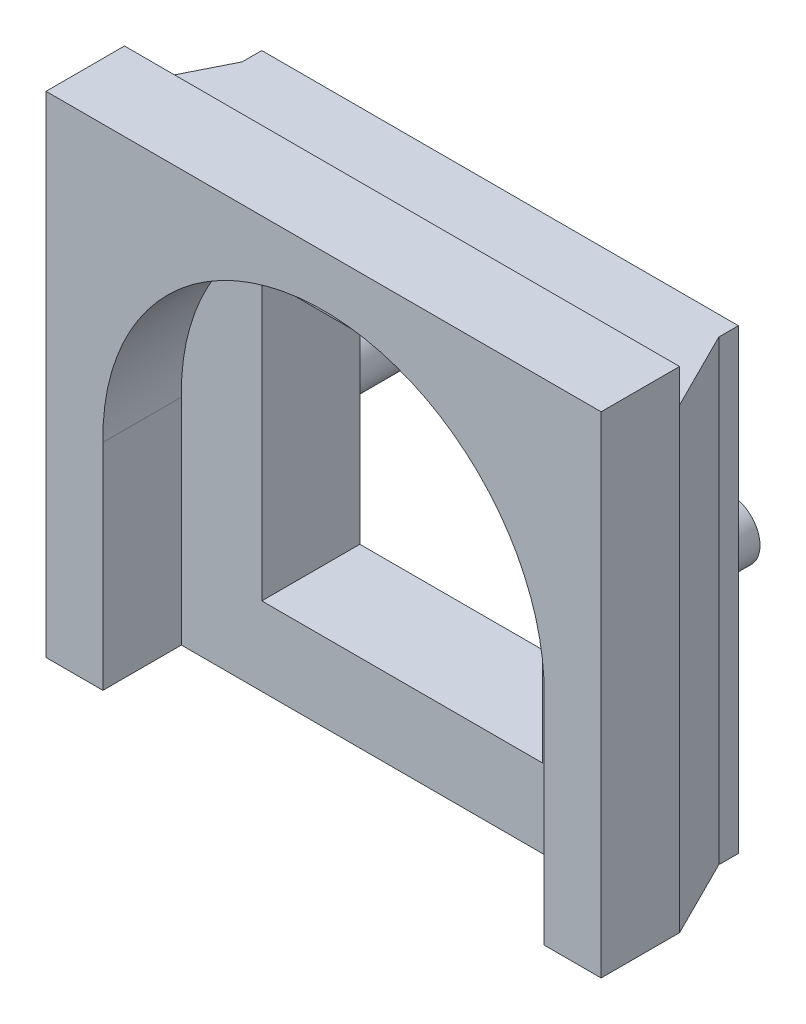
ISO-10303-21;
HEADER;
FILE_DESCRIPTION(('STEP AP214'),'2;1');
FILE_NAME('part.step','',(''),(''),'','','');
FILE_SCHEMA(('AUTOMOTIVE_DESIGN { 1 0 10303 214 1 1 1 1 }'));
ENDSEC;
DATA;
#1=APPLICATION_CONTEXT('core data for automotive mechanical design processes');
#2=APPLICATION_PROTOCOL_DEFINITION('international standard','automotive_design',2000,#1);
#3=PRODUCT_CONTEXT('',#1,'mechanical');
#4=PRODUCT('Part','Part','',(#3));
#5=PRODUCT_RELATED_PRODUCT_CATEGORY('part','',(#4));
#6=PRODUCT_DEFINITION_FORMATION('','',#4);
#7=PRODUCT_DEFINITION_CONTEXT('part definition',#1,'design');
#8=PRODUCT_DEFINITION('design','',#6,#7);
#9=PRODUCT_DEFINITION_SHAPE('','',#8);
#10=(LENGTH_UNIT() NAMED_UNIT(*) SI_UNIT(.MILLI.,.METRE.));
#11=(NAMED_UNIT(*) PLANE_ANGLE_UNIT() SI_UNIT($,.RADIAN.));
#12=(NAMED_UNIT(*) SI_UNIT($,.STERADIAN.) SOLID_ANGLE_UNIT());
#13=UNCERTAINTY_MEASURE_WITH_UNIT(LENGTH_MEASURE(1.E-05),#10,'distance_accuracy_value','');
#14=(GEOMETRIC_REPRESENTATION_CONTEXT(3) GLOBAL_UNCERTAINTY_ASSIGNED_CONTEXT((#13)) GLOBAL_UNIT_ASSIGNED_CONTEXT((#10,
#11,#12)) REPRESENTATION_CONTEXT('',''));
#15=CARTESIAN_POINT('',(0.,0.,0.));
#16=DIRECTION('',(0.,0.,1.));
#17=DIRECTION('',(1.,0.,0.));
#18=AXIS2_PLACEMENT_3D('',#15,#16,#17);
#19=CARTESIAN_POINT('',(0.,0.,4.));
#20=DIRECTION('',(0.,0.,1.));
#21=DIRECTION('',(1.,0.,0.));
#22=AXIS2_PLACEMENT_3D('',#19,#20,#21);
#23=PLANE('',#22);
#24=DIRECTION('',(0.,1.,0.));
#25=VECTOR('',#24,1.);
#26=CARTESIAN_POINT('',(14.15,-11.15,4.));
#27=LINE('',#26,#25);
#28=CARTESIAN_POINT('',(14.15,12.15,4.));
#29=VERTEX_POINT('',#28);
#30=CARTESIAN_POINT('',(14.15,13.85,4.));
#31=VERTEX_POINT('',#30);
#32=EDGE_CURVE('E221',#29,#31,#27,.T.);
#33=ORIENTED_EDGE('',*,*,#32,.F.);
#34=DIRECTION('',(-1.,0.,0.));
#35=VECTOR('',#34,1.);
#36=CARTESIAN_POINT('',(-12.15,12.15,4.));
#37=LINE('',#36,#35);
#38=CARTESIAN_POINT('',(-14.15,12.15,4.));
#39=VERTEX_POINT('',#38);
#40=EDGE_CURVE('E11',#29,#39,#37,.T.);
#41=ORIENTED_EDGE('',*,*,#40,.T.);
#42=DIRECTION('',(0.,-1.,0.));
#43=VECTOR('',#42,1.);
#44=CARTESIAN_POINT('',(-14.15,-11.15,4.));
#45=LINE('',#44,#43);
#46=CARTESIAN_POINT('',(-14.15,13.85,4.));
#47=VERTEX_POINT('',#46);
#48=EDGE_CURVE('E247',#47,#39,#45,.T.);
#49=ORIENTED_EDGE('',*,*,#48,.F.);
#50=DIRECTION('',(-1.,0.,0.));
#51=VECTOR('',#50,1.);
#52=CARTESIAN_POINT('',(-14.15,13.85,4.));
#53=LINE('',#52,#51);
#54=EDGE_CURVE('E245',#31,#47,#53,.T.);
#55=ORIENTED_EDGE('',*,*,#54,.F.);
#56=EDGE_LOOP('',(#33,#41,#49,#55));
#57=FACE_BOUND('',#56,.T.);
#58=ADVANCED_FACE('F33',(#57),#23,.F.);
#59=CARTESIAN_POINT('',(0.,0.,4.));
#60=DIRECTION('',(0.,0.,1.));
#61=DIRECTION('',(1.,0.,0.));
#62=AXIS2_PLACEMENT_3D('',#59,#60,#61);
#63=PLANE('',#62);
#64=DIRECTION('',(-1.,0.,0.));
#65=VECTOR('',#64,1.);
#66=CARTESIAN_POINT('',(-14.15,-11.15,4.));
#67=LINE('',#66,#65);
#68=CARTESIAN_POINT('',(11.2481903363964,-11.15,4.));
#69=VERTEX_POINT('',#68);
#70=CARTESIAN_POINT('',(-11.2481903363964,-11.15,4.));
#71=VERTEX_POINT('',#70);
#72=EDGE_CURVE('E205',#69,#71,#67,.T.);
#73=ORIENTED_EDGE('',*,*,#72,.F.);
#74=DIRECTION('',(0.,-1.,0.));
#75=VECTOR('',#74,1.);
#76=CARTESIAN_POINT('',(11.2481903363964,-0.201777491806097,4.));
#77=LINE('',#76,#75);
#78=CARTESIAN_POINT('',(11.2481903363964,-0.2017774918061,4.));
#79=VERTEX_POINT('',#78);
#80=EDGE_CURVE('E50',#79,#69,#77,.T.);
#81=ORIENTED_EDGE('',*,*,#80,.F.);
#82=CARTESIAN_POINT('',(0.,0.,4.));
#83=DIRECTION('',(0.,0.,-1.));
#84=DIRECTION('',(1.,0.,0.));
#85=AXIS2_PLACEMENT_3D('',#82,#83,#84);
#86=CIRCLE('',#85,11.25);
#87=CARTESIAN_POINT('',(-11.2481903363964,-0.201777491806106,4.));
#88=VERTEX_POINT('',#87);
#89=EDGE_CURVE('E54',#88,#79,#86,.T.);
#90=ORIENTED_EDGE('',*,*,#89,.F.);
#91=DIRECTION('',(0.,1.,0.));
#92=VECTOR('',#91,1.);
#93=CARTESIAN_POINT('',(-11.2481903363964,-0.201777491806106,4.));
#94=LINE('',#93,#92);
#95=EDGE_CURVE('E250',#71,#88,#94,.T.);
#96=ORIENTED_EDGE('',*,*,#95,.F.);
#97=EDGE_LOOP('',(#73,#81,#90,#96));
#98=FACE_BOUND('',#97,.T.);
#99=DIRECTION('',(-1.,0.,0.));
#100=VECTOR('',#99,1.);
#101=CARTESIAN_POINT('',(-7.15,7.15,4.));
#102=LINE('',#101,#100);
#103=CARTESIAN_POINT('',(7.15,7.15,4.));
#104=VERTEX_POINT('',#103);
#105=CARTESIAN_POINT('',(-7.15,7.15,4.));
#106=VERTEX_POINT('',#105);
#107=EDGE_CURVE('E285',#104,#106,#102,.T.);
#108=ORIENTED_EDGE('',*,*,#107,.F.);
#109=DIRECTION('',(0.,1.,0.));
#110=VECTOR('',#109,1.);
#111=CARTESIAN_POINT('',(7.15,7.15,4.));
#112=LINE('',#111,#110);
#113=CARTESIAN_POINT('',(7.15,-7.15,4.));
#114=VERTEX_POINT('',#113);
#115=EDGE_CURVE('E283',#114,#104,#112,.T.);
#116=ORIENTED_EDGE('',*,*,#115,.F.);
#117=DIRECTION('',(1.,0.,0.));
#118=VECTOR('',#117,1.);
#119=CARTESIAN_POINT('',(-7.15,-7.15,4.));
#120=LINE('',#119,#118);
#121=CARTESIAN_POINT('',(-7.15,-7.15,4.));
#122=VERTEX_POINT('',#121);
#123=EDGE_CURVE('E159',#122,#114,#120,.T.);
#124=ORIENTED_EDGE('',*,*,#123,.F.);
#125=DIRECTION('',(0.,-1.,0.));
#126=VECTOR('',#125,1.);
#127=CARTESIAN_POINT('',(-7.15,7.15,4.));
#128=LINE('',#127,#126);
#129=EDGE_CURVE('E287',#106,#122,#128,.T.);
#130=ORIENTED_EDGE('',*,*,#129,.F.);
#131=EDGE_LOOP('',(#108,#116,#124,#130));
#132=FACE_BOUND('',#131,.T.);
#133=ADVANCED_FACE('F341',(#98,#132),#63,.T.);
#134=CARTESIAN_POINT('',(-12.15,12.15,4.));
#135=DIRECTION('',(0.,-1.,0.));
#136=DIRECTION('',(0.,0.,-1.));
#137=AXIS2_PLACEMENT_3D('',#134,#135,#136);
#138=PLANE('',#137);
#139=DIRECTION('',(0.447213595499959,0.,0.894427190999915));
#140=VECTOR('',#139,1.);
#141=CARTESIAN_POINT('',(14.15,12.15,4.));
#142=LINE('',#141,#140);
#143=CARTESIAN_POINT('',(12.15,12.15,0.));
#144=VERTEX_POINT('',#143);
#145=EDGE_CURVE('E210',#144,#29,#142,.T.);
#146=ORIENTED_EDGE('',*,*,#145,.F.);
#147=DIRECTION('',(0.,0.,1.));
#148=VECTOR('',#147,1.);
#149=CARTESIAN_POINT('',(12.15,12.15,-1.));
#150=LINE('',#149,#148);
#151=CARTESIAN_POINT('',(12.15,12.15,-1.));
#152=VERTEX_POINT('',#151);
#153=EDGE_CURVE('E199',#152,#144,#150,.T.);
#154=ORIENTED_EDGE('',*,*,#153,.F.);
#155=DIRECTION('',(1.,0.,0.));
#156=VECTOR('',#155,1.);
#157=CARTESIAN_POINT('',(-12.15,12.15,-1.));
#158=LINE('',#157,#156);
#159=CARTESIAN_POINT('',(-12.15,12.15,-1.));
#160=VERTEX_POINT('',#159);
#161=EDGE_CURVE('E181',#160,#152,#158,.T.);
#162=ORIENTED_EDGE('',*,*,#161,.F.);
#163=DIRECTION('',(0.,0.,1.));
#164=VECTOR('',#163,1.);
#165=CARTESIAN_POINT('',(-12.15,12.15,-1.));
#166=LINE('',#165,#164);
#167=CARTESIAN_POINT('',(-12.15,12.15,0.));
#168=VERTEX_POINT('',#167);
#169=EDGE_CURVE('E190',#160,#168,#166,.T.);
#170=ORIENTED_EDGE('',*,*,#169,.T.);
#171=DIRECTION('',(0.447213595499957,0.,-0.894427190999917));
#172=VECTOR('',#171,1.);
#173=CARTESIAN_POINT('',(-12.15,12.15,0.));
#174=LINE('',#173,#172);
#175=EDGE_CURVE('E219',#39,#168,#174,.T.);
#176=ORIENTED_EDGE('',*,*,#175,.F.);
#177=ORIENTED_EDGE('',*,*,#40,.F.);
#178=EDGE_LOOP('',(#146,#154,#162,#170,#176,#177));
#179=FACE_BOUND('',#178,.T.);
#180=ADVANCED_FACE('F35',(#179),#138,.F.);
#181=CARTESIAN_POINT('',(7.15,7.15,4.));
#182=DIRECTION('',(-1.,0.,0.));
#183=DIRECTION('',(0.,-1.,0.));
#184=AXIS2_PLACEMENT_3D('',#181,#182,#183);
#185=PLANE('',#184);
#186=DIRECTION('',(0.,0.,-1.));
#187=VECTOR('',#186,1.);
#188=CARTESIAN_POINT('',(7.15,7.15,4.));
#189=LINE('',#188,#187);
#190=CARTESIAN_POINT('',(7.15,7.15,-1.));
#191=VERTEX_POINT('',#190);
#192=EDGE_CURVE('E168',#104,#191,#189,.T.);
#193=ORIENTED_EDGE('',*,*,#192,.T.);
#194=DIRECTION('',(0.,-1.,0.));
#195=VECTOR('',#194,1.);
#196=CARTESIAN_POINT('',(7.15,-7.15,-1.));
#197=LINE('',#196,#195);
#198=CARTESIAN_POINT('',(7.15,-7.15,-1.));
#199=VERTEX_POINT('',#198);
#200=EDGE_CURVE('E165',#191,#199,#197,.T.);
#201=ORIENTED_EDGE('',*,*,#200,.T.);
#202=DIRECTION('',(0.,0.,-1.));
#203=VECTOR('',#202,1.);
#204=CARTESIAN_POINT('',(7.15,-7.15,4.));
#205=LINE('',#204,#203);
#206=EDGE_CURVE('E152',#114,#199,#205,.T.);
#207=ORIENTED_EDGE('',*,*,#206,.F.);
#208=ORIENTED_EDGE('',*,*,#115,.T.);
#209=EDGE_LOOP('',(#193,#201,#207,#208));
#210=FACE_BOUND('',#209,.T.);
#211=ADVANCED_FACE('F166',(#210),#185,.T.);
#212=CARTESIAN_POINT('',(-7.15,7.15,4.));
#213=DIRECTION('',(0.,-1.,0.));
#214=DIRECTION('',(0.,0.,-1.));
#215=AXIS2_PLACEMENT_3D('',#212,#213,#214);
#216=PLANE('',#215);
#217=DIRECTION('',(0.,0.,-1.));
#218=VECTOR('',#217,1.);
#219=CARTESIAN_POINT('',(-7.15,7.15,4.));
#220=LINE('',#219,#218);
#221=CARTESIAN_POINT('',(-7.15,7.15,-1.));
#222=VERTEX_POINT('',#221);
#223=EDGE_CURVE('E292',#106,#222,#220,.T.);
#224=ORIENTED_EDGE('',*,*,#223,.T.);
#225=DIRECTION('',(1.,0.,0.));
#226=VECTOR('',#225,1.);
#227=CARTESIAN_POINT('',(7.15,7.15,-1.));
#228=LINE('',#227,#226);
#229=EDGE_CURVE('E177',#222,#191,#228,.T.);
#230=ORIENTED_EDGE('',*,*,#229,.T.);
#231=ORIENTED_EDGE('',*,*,#192,.F.);
#232=ORIENTED_EDGE('',*,*,#107,.T.);
#233=EDGE_LOOP('',(#224,#230,#231,#232));
#234=FACE_BOUND('',#233,.T.);
#235=ADVANCED_FACE('F356',(#234),#216,.T.);
#236=CARTESIAN_POINT('',(-7.15,7.15,4.));
#237=DIRECTION('',(1.,0.,0.));
#238=DIRECTION('',(0.,1.,0.));
#239=AXIS2_PLACEMENT_3D('',#236,#237,#238);
#240=PLANE('',#239);
#241=DIRECTION('',(0.,0.,-1.));
#242=VECTOR('',#241,1.);
#243=CARTESIAN_POINT('',(-7.15,-7.15,4.));
#244=LINE('',#243,#242);
#245=CARTESIAN_POINT('',(-7.15,-7.15,-1.));
#246=VERTEX_POINT('',#245);
#247=EDGE_CURVE('E162',#122,#246,#244,.T.);
#248=ORIENTED_EDGE('',*,*,#247,.T.);
#249=DIRECTION('',(0.,1.,0.));
#250=VECTOR('',#249,1.);
#251=CARTESIAN_POINT('',(-7.15,7.15,-1.));
#252=LINE('',#251,#250);
#253=EDGE_CURVE('E175',#246,#222,#252,.T.);
#254=ORIENTED_EDGE('',*,*,#253,.T.);
#255=ORIENTED_EDGE('',*,*,#223,.F.);
#256=ORIENTED_EDGE('',*,*,#129,.T.);
#257=EDGE_LOOP('',(#248,#254,#255,#256));
#258=FACE_BOUND('',#257,.T.);
#259=ADVANCED_FACE('F399',(#258),#240,.T.);
#260=CARTESIAN_POINT('',(-7.15,-7.15,4.));
#261=DIRECTION('',(0.,1.,0.));
#262=DIRECTION('',(0.,0.,1.));
#263=AXIS2_PLACEMENT_3D('',#260,#261,#262);
#264=PLANE('',#263);
#265=ORIENTED_EDGE('',*,*,#206,.T.);
#266=DIRECTION('',(-1.,0.,0.));
#267=VECTOR('',#266,1.);
#268=CARTESIAN_POINT('',(-7.15,-7.15,-1.));
#269=LINE('',#268,#267);
#270=EDGE_CURVE('E156',#199,#246,#269,.T.);
#271=ORIENTED_EDGE('',*,*,#270,.T.);
#272=ORIENTED_EDGE('',*,*,#247,.F.);
#273=ORIENTED_EDGE('',*,*,#123,.T.);
#274=EDGE_LOOP('',(#265,#271,#272,#273));
#275=FACE_BOUND('',#274,.T.);
#276=ADVANCED_FACE('F154',(#275),#264,.T.);
#277=CARTESIAN_POINT('',(14.15,-11.15,8.));
#278=DIRECTION('',(-1.,0.,0.));
#279=DIRECTION('',(0.,0.,1.));
#280=AXIS2_PLACEMENT_3D('',#277,#278,#279);
#281=PLANE('',#280);
#282=CARTESIAN_POINT('',(14.15,-11.15,4.));
#283=VERTEX_POINT('',#282);
#284=EDGE_CURVE('E242',#283,#29,#27,.T.);
#285=ORIENTED_EDGE('',*,*,#284,.T.);
#286=ORIENTED_EDGE('',*,*,#32,.T.);
#287=DIRECTION('',(0.,0.,-1.));
#288=VECTOR('',#287,1.);
#289=CARTESIAN_POINT('',(14.15,13.85,8.));
#290=LINE('',#289,#288);
#291=CARTESIAN_POINT('',(14.15,13.85,8.));
#292=VERTEX_POINT('',#291);
#293=EDGE_CURVE('E274',#292,#31,#290,.T.);
#294=ORIENTED_EDGE('',*,*,#293,.F.);
#295=DIRECTION('',(0.,1.,0.));
#296=VECTOR('',#295,1.);
#297=CARTESIAN_POINT('',(14.15,-11.15,8.));
#298=LINE('',#297,#296);
#299=CARTESIAN_POINT('',(14.15,-11.15,8.));
#300=VERTEX_POINT('',#299);
#301=EDGE_CURVE('E224',#300,#292,#298,.T.);
#302=ORIENTED_EDGE('',*,*,#301,.F.);
#303=DIRECTION('',(0.,0.,-1.));
#304=VECTOR('',#303,1.);
#305=CARTESIAN_POINT('',(14.15,-11.15,8.));
#306=LINE('',#305,#304);
#307=EDGE_CURVE('E241',#300,#283,#306,.T.);
#308=ORIENTED_EDGE('',*,*,#307,.T.);
#309=EDGE_LOOP('',(#285,#286,#294,#302,#308));
#310=FACE_BOUND('',#309,.T.);
#311=ADVANCED_FACE('F323',(#310),#281,.F.);
#312=CARTESIAN_POINT('',(-14.15,13.85,8.));
#313=DIRECTION('',(0.,-1.,0.));
#314=DIRECTION('',(0.,0.,-1.));
#315=AXIS2_PLACEMENT_3D('',#312,#313,#314);
#316=PLANE('',#315);
#317=ORIENTED_EDGE('',*,*,#54,.T.);
#318=DIRECTION('',(0.,0.,-1.));
#319=VECTOR('',#318,1.);
#320=CARTESIAN_POINT('',(-14.15,13.85,8.));
#321=LINE('',#320,#319);
#322=CARTESIAN_POINT('',(-14.15,13.85,8.));
#323=VERTEX_POINT('',#322);
#324=EDGE_CURVE('E271',#323,#47,#321,.T.);
#325=ORIENTED_EDGE('',*,*,#324,.F.);
#326=DIRECTION('',(-1.,0.,0.));
#327=VECTOR('',#326,1.);
#328=CARTESIAN_POINT('',(-14.15,13.85,8.));
#329=LINE('',#328,#327);
#330=EDGE_CURVE('E227',#292,#323,#329,.T.);
#331=ORIENTED_EDGE('',*,*,#330,.F.);
#332=ORIENTED_EDGE('',*,*,#293,.T.);
#333=EDGE_LOOP('',(#317,#325,#331,#332));
#334=FACE_BOUND('',#333,.T.);
#335=ADVANCED_FACE('F375',(#334),#316,.F.);
#336=CARTESIAN_POINT('',(-14.15,-11.15,8.));
#337=DIRECTION('',(1.,0.,0.));
#338=DIRECTION('',(0.,0.,-1.));
#339=AXIS2_PLACEMENT_3D('',#336,#337,#338);
#340=PLANE('',#339);
#341=ORIENTED_EDGE('',*,*,#48,.T.);
#342=DIRECTION('',(0.,-1.,0.));
#343=VECTOR('',#342,1.);
#344=CARTESIAN_POINT('',(-14.15,16.6221359549996,4.));
#345=LINE('',#344,#343);
#346=CARTESIAN_POINT('',(-14.15,-11.15,4.));
#347=VERTEX_POINT('',#346);
#348=EDGE_CURVE('E218',#39,#347,#345,.T.);
#349=ORIENTED_EDGE('',*,*,#348,.T.);
#350=DIRECTION('',(0.,0.,-1.));
#351=VECTOR('',#350,1.);
#352=CARTESIAN_POINT('',(-14.15,-11.15,8.));
#353=LINE('',#352,#351);
#354=CARTESIAN_POINT('',(-14.15,-11.15,8.));
#355=VERTEX_POINT('',#354);
#356=EDGE_CURVE('E268',#355,#347,#353,.T.);
#357=ORIENTED_EDGE('',*,*,#356,.F.);
#358=DIRECTION('',(0.,-1.,0.));
#359=VECTOR('',#358,1.);
#360=CARTESIAN_POINT('',(-14.15,-11.15,8.));
#361=LINE('',#360,#359);
#362=EDGE_CURVE('E229',#323,#355,#361,.T.);
#363=ORIENTED_EDGE('',*,*,#362,.F.);
#364=ORIENTED_EDGE('',*,*,#324,.T.);
#365=EDGE_LOOP('',(#341,#349,#357,#363,#364));
#366=FACE_BOUND('',#365,.T.);
#367=ADVANCED_FACE('F346',(#366),#340,.F.);
#368=CARTESIAN_POINT('',(-11.2481903363964,-11.15,8.));
#369=DIRECTION('',(0.,1.,0.));
#370=DIRECTION('',(-1.,0.,0.));
#371=AXIS2_PLACEMENT_3D('',#368,#369,#370);
#372=PLANE('',#371);
#373=DIRECTION('',(0.447213595499957,0.,-0.894427190999917));
#374=VECTOR('',#373,1.);
#375=CARTESIAN_POINT('',(-12.15,-11.15,0.));
#376=LINE('',#375,#374);
#377=CARTESIAN_POINT('',(-12.15,-11.15,0.));
#378=VERTEX_POINT('',#377);
#379=EDGE_CURVE('E213',#347,#378,#376,.T.);
#380=ORIENTED_EDGE('',*,*,#379,.T.);
#381=DIRECTION('',(0.,0.,1.));
#382=VECTOR('',#381,1.);
#383=CARTESIAN_POINT('',(-12.15,-11.15,-1.));
#384=LINE('',#383,#382);
#385=CARTESIAN_POINT('',(-12.15,-11.15,-1.));
#386=VERTEX_POINT('',#385);
#387=EDGE_CURVE('E193',#386,#378,#384,.T.);
#388=ORIENTED_EDGE('',*,*,#387,.F.);
#389=DIRECTION('',(-1.,0.,0.));
#390=VECTOR('',#389,1.);
#391=CARTESIAN_POINT('',(12.15,-11.15,-1.));
#392=LINE('',#391,#390);
#393=CARTESIAN_POINT('',(12.15,-11.15,-1.));
#394=VERTEX_POINT('',#393);
#395=EDGE_CURVE('E186',#394,#386,#392,.T.);
#396=ORIENTED_EDGE('',*,*,#395,.F.);
#397=DIRECTION('',(0.,0.,1.));
#398=VECTOR('',#397,1.);
#399=CARTESIAN_POINT('',(12.15,-11.15,-1.));
#400=LINE('',#399,#398);
#401=CARTESIAN_POINT('',(12.15,-11.15,0.));
#402=VERTEX_POINT('',#401);
#403=EDGE_CURVE('E196',#394,#402,#400,.T.);
#404=ORIENTED_EDGE('',*,*,#403,.T.);
#405=DIRECTION('',(0.447213595499959,0.,0.894427190999915));
#406=VECTOR('',#405,1.);
#407=CARTESIAN_POINT('',(14.15,-11.15,4.));
#408=LINE('',#407,#406);
#409=EDGE_CURVE('E207',#402,#283,#408,.T.);
#410=ORIENTED_EDGE('',*,*,#409,.T.);
#411=ORIENTED_EDGE('',*,*,#307,.F.);
#412=DIRECTION('',(1.,0.,0.));
#413=VECTOR('',#412,1.);
#414=CARTESIAN_POINT('',(11.2481903363964,-11.15,8.));
#415=LINE('',#414,#413);
#416=CARTESIAN_POINT('',(11.2481903363964,-11.15,8.));
#417=VERTEX_POINT('',#416);
#418=EDGE_CURVE('E239',#417,#300,#415,.T.);
#419=ORIENTED_EDGE('',*,*,#418,.F.);
#420=DIRECTION('',(0.,0.,-1.));
#421=VECTOR('',#420,1.);
#422=CARTESIAN_POINT('',(11.2481903363964,-11.15,8.));
#423=LINE('',#422,#421);
#424=EDGE_CURVE('E256',#417,#69,#423,.T.);
#425=ORIENTED_EDGE('',*,*,#424,.T.);
#426=ORIENTED_EDGE('',*,*,#72,.T.);
#427=DIRECTION('',(0.,0.,-1.));
#428=VECTOR('',#427,1.);
#429=CARTESIAN_POINT('',(-11.2481903363964,-11.15,8.));
#430=LINE('',#429,#428);
#431=CARTESIAN_POINT('',(-11.2481903363964,-11.15,8.));
#432=VERTEX_POINT('',#431);
#433=EDGE_CURVE('E265',#432,#71,#430,.T.);
#434=ORIENTED_EDGE('',*,*,#433,.F.);
#435=DIRECTION('',(1.,0.,0.));
#436=VECTOR('',#435,1.);
#437=CARTESIAN_POINT('',(-11.2481903363964,-11.15,8.));
#438=LINE('',#437,#436);
#439=EDGE_CURVE('E231',#355,#432,#438,.T.);
#440=ORIENTED_EDGE('',*,*,#439,.F.);
#441=ORIENTED_EDGE('',*,*,#356,.T.);
#442=EDGE_LOOP('',(#380,#388,#396,#404,#410,#411,#419,#425,#426,#434,#440,#441));
#443=FACE_BOUND('',#442,.T.);
#444=ADVANCED_FACE('F303',(#443),#372,.F.);
#445=CARTESIAN_POINT('',(-11.2481903363964,-0.201777491806106,8.));
#446=DIRECTION('',(-1.,0.,0.));
#447=DIRECTION('',(0.,0.,1.));
#448=AXIS2_PLACEMENT_3D('',#445,#446,#447);
#449=PLANE('',#448);
#450=ORIENTED_EDGE('',*,*,#95,.T.);
#451=DIRECTION('',(0.,0.,-1.));
#452=VECTOR('',#451,1.);
#453=CARTESIAN_POINT('',(-11.2481903363964,-0.201777491806106,8.));
#454=LINE('',#453,#452);
#455=CARTESIAN_POINT('',(-11.2481903363964,-0.201777491806106,8.));
#456=VERTEX_POINT('',#455);
#457=EDGE_CURVE('E262',#456,#88,#454,.T.);
#458=ORIENTED_EDGE('',*,*,#457,.F.);
#459=DIRECTION('',(0.,1.,0.));
#460=VECTOR('',#459,1.);
#461=CARTESIAN_POINT('',(-11.2481903363964,-0.201777491806106,8.));
#462=LINE('',#461,#460);
#463=EDGE_CURVE('E233',#432,#456,#462,.T.);
#464=ORIENTED_EDGE('',*,*,#463,.F.);
#465=ORIENTED_EDGE('',*,*,#433,.T.);
#466=EDGE_LOOP('',(#450,#458,#464,#465));
#467=FACE_BOUND('',#466,.T.);
#468=ADVANCED_FACE('F339',(#467),#449,.F.);
#469=CARTESIAN_POINT('',(0.,0.,8.));
#470=DIRECTION('',(0.,0.,-1.));
#471=DIRECTION('',(-1.,0.,0.));
#472=AXIS2_PLACEMENT_3D('',#469,#470,#471);
#473=CYLINDRICAL_SURFACE('',#472,11.25);
#474=ORIENTED_EDGE('',*,*,#89,.T.);
#475=DIRECTION('',(0.,0.,-1.));
#476=VECTOR('',#475,1.);
#477=CARTESIAN_POINT('',(11.2481903363964,-0.2017774918061,8.));
#478=LINE('',#477,#476);
#479=CARTESIAN_POINT('',(11.2481903363964,-0.2017774918061,8.));
#480=VERTEX_POINT('',#479);
#481=EDGE_CURVE('E259',#480,#79,#478,.T.);
#482=ORIENTED_EDGE('',*,*,#481,.F.);
#483=CARTESIAN_POINT('',(0.,0.,8.));
#484=DIRECTION('',(0.,0.,-1.));
#485=DIRECTION('',(1.,0.,0.));
#486=AXIS2_PLACEMENT_3D('',#483,#484,#485);
#487=CIRCLE('',#486,11.25);
#488=EDGE_CURVE('E235',#456,#480,#487,.T.);
#489=ORIENTED_EDGE('',*,*,#488,.F.);
#490=ORIENTED_EDGE('',*,*,#457,.T.);
#491=EDGE_LOOP('',(#474,#482,#489,#490));
#492=FACE_BOUND('',#491,.T.);
#493=ADVANCED_FACE('F335',(#492),#473,.F.);
#494=CARTESIAN_POINT('',(11.2481903363964,-0.201777491806097,8.));
#495=DIRECTION('',(1.,0.,0.));
#496=DIRECTION('',(0.,0.,-1.));
#497=AXIS2_PLACEMENT_3D('',#494,#495,#496);
#498=PLANE('',#497);
#499=ORIENTED_EDGE('',*,*,#80,.T.);
#500=ORIENTED_EDGE('',*,*,#424,.F.);
#501=DIRECTION('',(0.,-1.,0.));
#502=VECTOR('',#501,1.);
#503=CARTESIAN_POINT('',(11.2481903363964,-0.201777491806097,8.));
#504=LINE('',#503,#502);
#505=EDGE_CURVE('E237',#480,#417,#504,.T.);
#506=ORIENTED_EDGE('',*,*,#505,.F.);
#507=ORIENTED_EDGE('',*,*,#481,.T.);
#508=EDGE_LOOP('',(#499,#500,#506,#507));
#509=FACE_BOUND('',#508,.T.);
#510=ADVANCED_FACE('F333',(#509),#498,.F.);
#511=CARTESIAN_POINT('',(0.,0.,8.));
#512=DIRECTION('',(0.,0.,1.));
#513=DIRECTION('',(1.,0.,0.));
#514=AXIS2_PLACEMENT_3D('',#511,#512,#513);
#515=PLANE('',#514);
#516=ORIENTED_EDGE('',*,*,#301,.T.);
#517=ORIENTED_EDGE('',*,*,#330,.T.);
#518=ORIENTED_EDGE('',*,*,#362,.T.);
#519=ORIENTED_EDGE('',*,*,#439,.T.);
#520=ORIENTED_EDGE('',*,*,#463,.T.);
#521=ORIENTED_EDGE('',*,*,#488,.T.);
#522=ORIENTED_EDGE('',*,*,#505,.T.);
#523=ORIENTED_EDGE('',*,*,#418,.T.);
#524=EDGE_LOOP('',(#516,#517,#518,#519,#520,#521,#522,#523));
#525=FACE_BOUND('',#524,.T.);
#526=ADVANCED_FACE('F328',(#525),#515,.T.);
#527=CARTESIAN_POINT('',(-12.15,16.6221359549996,0.));
#528=DIRECTION('',(0.894427190999916,0.,0.447213595499957));
#529=DIRECTION('',(0.447213595499957,0.,-0.894427190999917));
#530=AXIS2_PLACEMENT_3D('',#527,#528,#529);
#531=PLANE('',#530);
#532=ORIENTED_EDGE('',*,*,#348,.F.);
#533=ORIENTED_EDGE('',*,*,#175,.T.);
#534=DIRECTION('',(0.,-1.,0.));
#535=VECTOR('',#534,1.);
#536=CARTESIAN_POINT('',(-12.15,12.15,0.));
#537=LINE('',#536,#535);
#538=EDGE_CURVE('E42',#168,#378,#537,.T.);
#539=ORIENTED_EDGE('',*,*,#538,.T.);
#540=ORIENTED_EDGE('',*,*,#379,.F.);
#541=EDGE_LOOP('',(#532,#533,#539,#540));
#542=FACE_BOUND('',#541,.T.);
#543=ADVANCED_FACE('F297',(#542),#531,.F.);
#544=CARTESIAN_POINT('',(14.15,16.6221359549996,4.));
#545=DIRECTION('',(-0.894427190999915,0.,0.447213595499959));
#546=DIRECTION('',(0.447213595499959,0.,0.894427190999915));
#547=AXIS2_PLACEMENT_3D('',#544,#545,#546);
#548=PLANE('',#547);
#549=DIRECTION('',(0.,-1.,0.));
#550=VECTOR('',#549,1.);
#551=CARTESIAN_POINT('',(12.15,16.6221359549996,0.));
#552=LINE('',#551,#550);
#553=EDGE_CURVE('E209',#144,#402,#552,.T.);
#554=ORIENTED_EDGE('',*,*,#553,.F.);
#555=ORIENTED_EDGE('',*,*,#145,.T.);
#556=ORIENTED_EDGE('',*,*,#284,.F.);
#557=ORIENTED_EDGE('',*,*,#409,.F.);
#558=EDGE_LOOP('',(#554,#555,#556,#557));
#559=FACE_BOUND('',#558,.T.);
#560=ADVANCED_FACE('F319',(#559),#548,.F.);
#561=CARTESIAN_POINT('',(0.,0.,-1.));
#562=DIRECTION('',(0.,0.,-1.));
#563=DIRECTION('',(-1.,0.,0.));
#564=AXIS2_PLACEMENT_3D('',#561,#562,#563);
#565=PLANE('',#564);
#566=CARTESIAN_POINT('',(-8.75,0.,-1.));
#567=DIRECTION('',(0.,0.,-1.));
#568=DIRECTION('',(-1.,0.,0.));
#569=AXIS2_PLACEMENT_3D('',#566,#567,#568);
#570=CIRCLE('',#569,1.5);
#571=CARTESIAN_POINT('',(-10.25,0.,-1.));
#572=VERTEX_POINT('',#571);
#573=EDGE_CURVE('E202',#572,#572,#570,.T.);
#574=ORIENTED_EDGE('',*,*,#573,.F.);
#575=EDGE_LOOP('',(#574));
#576=FACE_BOUND('',#575,.T.);
#577=CARTESIAN_POINT('',(8.75,0.,-1.));
#578=DIRECTION('',(0.,0.,-1.));
#579=DIRECTION('',(-1.,0.,0.));
#580=AXIS2_PLACEMENT_3D('',#577,#578,#579);
#581=CIRCLE('',#580,1.5);
#582=CARTESIAN_POINT('',(7.25,0.,-1.));
#583=VERTEX_POINT('',#582);
#584=EDGE_CURVE('E37',#583,#583,#581,.T.);
#585=ORIENTED_EDGE('',*,*,#584,.F.);
#586=EDGE_LOOP('',(#585));
#587=FACE_BOUND('',#586,.T.);
#588=ORIENTED_EDGE('',*,*,#161,.T.);
#589=DIRECTION('',(0.,-1.,0.));
#590=VECTOR('',#589,1.);
#591=CARTESIAN_POINT('',(12.15,12.15,-1.));
#592=LINE('',#591,#590);
#593=EDGE_CURVE('E184',#152,#394,#592,.T.);
#594=ORIENTED_EDGE('',*,*,#593,.T.);
#595=ORIENTED_EDGE('',*,*,#395,.T.);
#596=DIRECTION('',(0.,1.,0.));
#597=VECTOR('',#596,1.);
#598=CARTESIAN_POINT('',(-12.15,-11.15,-1.));
#599=LINE('',#598,#597);
#600=EDGE_CURVE('E188',#386,#160,#599,.T.);
#601=ORIENTED_EDGE('',*,*,#600,.T.);
#602=EDGE_LOOP('',(#588,#594,#595,#601));
#603=FACE_BOUND('',#602,.T.);
#604=ORIENTED_EDGE('',*,*,#270,.F.);
#605=ORIENTED_EDGE('',*,*,#200,.F.);
#606=ORIENTED_EDGE('',*,*,#229,.F.);
#607=ORIENTED_EDGE('',*,*,#253,.F.);
#608=EDGE_LOOP('',(#604,#605,#606,#607));
#609=FACE_BOUND('',#608,.T.);
#610=ADVANCED_FACE('F173',(#576,#587,#603,#609),#565,.T.);
#611=CARTESIAN_POINT('',(12.15,12.15,-1.));
#612=DIRECTION('',(-1.,0.,0.));
#613=DIRECTION('',(0.,0.,1.));
#614=AXIS2_PLACEMENT_3D('',#611,#612,#613);
#615=PLANE('',#614);
#616=ORIENTED_EDGE('',*,*,#553,.T.);
#617=ORIENTED_EDGE('',*,*,#403,.F.);
#618=ORIENTED_EDGE('',*,*,#593,.F.);
#619=ORIENTED_EDGE('',*,*,#153,.T.);
#620=EDGE_LOOP('',(#616,#617,#618,#619));
#621=FACE_BOUND('',#620,.T.);
#622=ADVANCED_FACE('F316',(#621),#615,.F.);
#623=CARTESIAN_POINT('',(-12.15,-11.15,-1.));
#624=DIRECTION('',(1.,0.,0.));
#625=DIRECTION('',(0.,0.,-1.));
#626=AXIS2_PLACEMENT_3D('',#623,#624,#625);
#627=PLANE('',#626);
#628=ORIENTED_EDGE('',*,*,#538,.F.);
#629=ORIENTED_EDGE('',*,*,#169,.F.);
#630=ORIENTED_EDGE('',*,*,#600,.F.);
#631=ORIENTED_EDGE('',*,*,#387,.T.);
#632=EDGE_LOOP('',(#628,#629,#630,#631));
#633=FACE_BOUND('',#632,.T.);
#634=ADVANCED_FACE('F308',(#633),#627,.F.);
#635=CARTESIAN_POINT('',(8.75,0.,-4.));
#636=DIRECTION('',(0.,0.,1.));
#637=DIRECTION('',(1.,0.,0.));
#638=AXIS2_PLACEMENT_3D('',#635,#636,#637);
#639=PLANE('',#638);
#640=CARTESIAN_POINT('',(8.75,0.,-4.));
#641=DIRECTION('',(0.,0.,-1.));
#642=DIRECTION('',(1.,0.,0.));
#643=AXIS2_PLACEMENT_3D('',#640,#641,#642);
#644=CIRCLE('',#643,1.5);
#645=CARTESIAN_POINT('',(10.25,0.,-4.));
#646=VERTEX_POINT('',#645);
#647=EDGE_CURVE('E277',#646,#646,#644,.T.);
#648=ORIENTED_EDGE('',*,*,#647,.T.);
#649=EDGE_LOOP('',(#648));
#650=FACE_BOUND('',#649,.T.);
#651=ADVANCED_FACE('F381',(#650),#639,.F.);
#652=CARTESIAN_POINT('',(8.75,0.,-4.));
#653=DIRECTION('',(0.,0.,1.));
#654=DIRECTION('',(1.,0.,0.));
#655=AXIS2_PLACEMENT_3D('',#652,#653,#654);
#656=CYLINDRICAL_SURFACE('',#655,1.5);
#657=ORIENTED_EDGE('',*,*,#584,.T.);
#658=EDGE_LOOP('',(#657));
#659=FACE_BOUND('',#658,.T.);
#660=ORIENTED_EDGE('',*,*,#647,.F.);
#661=EDGE_LOOP('',(#660));
#662=FACE_BOUND('',#661,.T.);
#663=ADVANCED_FACE('F384',(#659,#662),#656,.T.);
#664=CARTESIAN_POINT('',(-8.75,0.,-4.));
#665=DIRECTION('',(0.,0.,-1.));
#666=DIRECTION('',(-1.,0.,0.));
#667=AXIS2_PLACEMENT_3D('',#664,#665,#666);
#668=PLANE('',#667);
#669=CARTESIAN_POINT('',(-8.75,0.,-4.));
#670=DIRECTION('',(0.,0.,-1.));
#671=DIRECTION('',(-1.,0.,0.));
#672=AXIS2_PLACEMENT_3D('',#669,#670,#671);
#673=CIRCLE('',#672,1.5);
#674=CARTESIAN_POINT('',(-10.25,0.,-4.));
#675=VERTEX_POINT('',#674);
#676=EDGE_CURVE('E280',#675,#675,#673,.T.);
#677=ORIENTED_EDGE('',*,*,#676,.T.);
#678=EDGE_LOOP('',(#677));
#679=FACE_BOUND('',#678,.T.);
#680=ADVANCED_FACE('F388',(#679),#668,.T.);
#681=CARTESIAN_POINT('',(-8.75,0.,-4.));
#682=DIRECTION('',(0.,0.,1.));
#683=DIRECTION('',(1.,0.,0.));
#684=AXIS2_PLACEMENT_3D('',#681,#682,#683);
#685=CYLINDRICAL_SURFACE('',#684,1.5);
#686=ORIENTED_EDGE('',*,*,#573,.T.);
#687=EDGE_LOOP('',(#686));
#688=FACE_BOUND('',#687,.T.);
#689=ORIENTED_EDGE('',*,*,#676,.F.);
#690=EDGE_LOOP('',(#689));
#691=FACE_BOUND('',#690,.T.);
#692=ADVANCED_FACE('F392',(#688,#691),#685,.T.);
#693=CLOSED_SHELL('',(#58,#133,#180,#211,#235,#259,#276,#311,#335,#367,#444,#468,#493,#510,#526,
#543,#560,#610,#622,#634,#651,#663,#680,#692));
#694=MANIFOLD_SOLID_BREP('B2',#693);
#695=ADVANCED_BREP_SHAPE_REPRESENTATION('',(#18,#694),#14);
#696=SHAPE_DEFINITION_REPRESENTATION(#9,#695);
ENDSEC;
END-ISO-10303-21;
